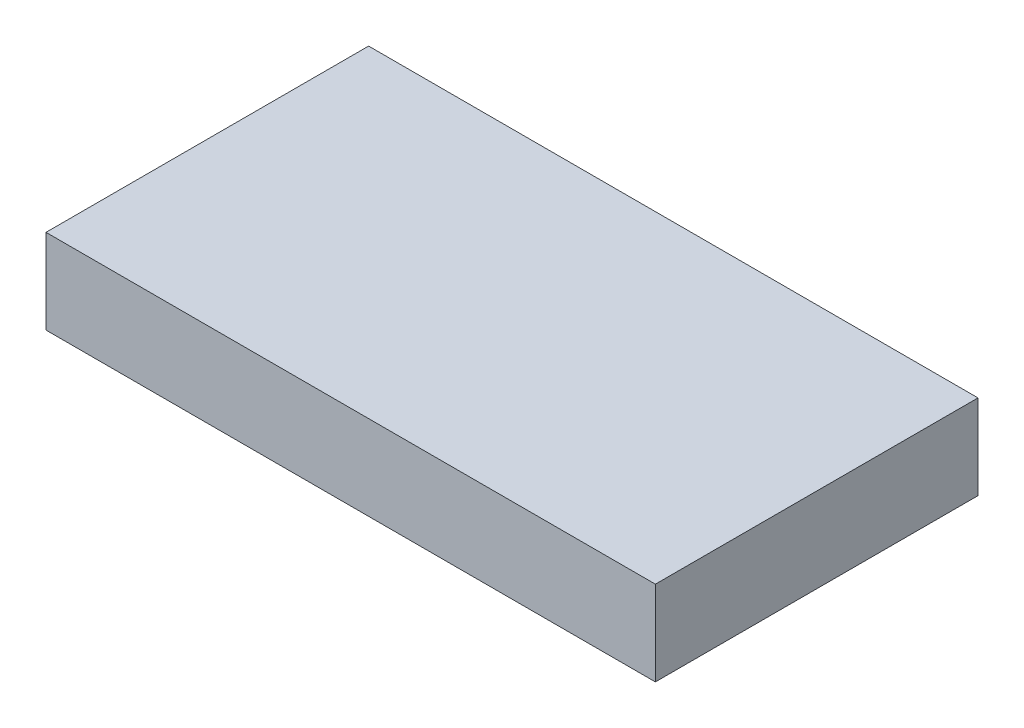
ISO-10303-21;
HEADER;
FILE_DESCRIPTION(('STEP AP214'),'2;1');
FILE_NAME('part.step','',(''),(''),'','','');
FILE_SCHEMA(('AUTOMOTIVE_DESIGN { 1 0 10303 214 1 1 1 1 }'));
ENDSEC;
DATA;
#1=APPLICATION_CONTEXT('core data for automotive mechanical design processes');
#2=APPLICATION_PROTOCOL_DEFINITION('international standard','automotive_design',2000,#1);
#3=PRODUCT_CONTEXT('',#1,'mechanical');
#4=PRODUCT('Part','Part','',(#3));
#5=PRODUCT_RELATED_PRODUCT_CATEGORY('part','',(#4));
#6=PRODUCT_DEFINITION_FORMATION('','',#4);
#7=PRODUCT_DEFINITION_CONTEXT('part definition',#1,'design');
#8=PRODUCT_DEFINITION('design','',#6,#7);
#9=PRODUCT_DEFINITION_SHAPE('','',#8);
#10=(LENGTH_UNIT() NAMED_UNIT(*) SI_UNIT(.MILLI.,.METRE.));
#11=(NAMED_UNIT(*) PLANE_ANGLE_UNIT() SI_UNIT($,.RADIAN.));
#12=(NAMED_UNIT(*) SI_UNIT($,.STERADIAN.) SOLID_ANGLE_UNIT());
#13=UNCERTAINTY_MEASURE_WITH_UNIT(LENGTH_MEASURE(1.E-05),#10,'distance_accuracy_value','');
#14=(GEOMETRIC_REPRESENTATION_CONTEXT(3) GLOBAL_UNCERTAINTY_ASSIGNED_CONTEXT((#13)) GLOBAL_UNIT_ASSIGNED_CONTEXT((#10,
#11,#12)) REPRESENTATION_CONTEXT('',''));
#15=CARTESIAN_POINT('',(0.,0.,0.));
#16=DIRECTION('',(0.,0.,1.));
#17=DIRECTION('',(1.,0.,0.));
#18=AXIS2_PLACEMENT_3D('',#15,#16,#17);
#19=CARTESIAN_POINT('',(-100.45736928953,30.,-18.4232950355312));
#20=DIRECTION('',(1.,0.,0.));
#21=DIRECTION('',(0.,0.,-1.));
#22=AXIS2_PLACEMENT_3D('',#19,#20,#21);
#23=PLANE('',#22);
#24=DIRECTION('',(0.,0.,1.));
#25=VECTOR('',#24,1.);
#26=CARTESIAN_POINT('',(-100.45736928953,0.,-18.4232950355312));
#27=LINE('',#26,#25);
#28=CARTESIAN_POINT('',(-100.45736928953,0.,-18.4232950355312));
#29=VERTEX_POINT('',#28);
#30=CARTESIAN_POINT('',(-100.45736928953,0.,95.8767049644688));
#31=VERTEX_POINT('',#30);
#32=EDGE_CURVE('E96',#29,#31,#27,.T.);
#33=ORIENTED_EDGE('',*,*,#32,.T.);
#34=DIRECTION('',(0.,-1.,0.));
#35=VECTOR('',#34,1.);
#36=CARTESIAN_POINT('',(-100.45736928953,30.,95.8767049644688));
#37=LINE('',#36,#35);
#38=CARTESIAN_POINT('',(-100.45736928953,30.,95.8767049644688));
#39=VERTEX_POINT('',#38);
#40=EDGE_CURVE('E11',#39,#31,#37,.T.);
#41=ORIENTED_EDGE('',*,*,#40,.F.);
#42=DIRECTION('',(0.,0.,1.));
#43=VECTOR('',#42,1.);
#44=CARTESIAN_POINT('',(-100.45736928953,30.,-18.4232950355312));
#45=LINE('',#44,#43);
#46=CARTESIAN_POINT('',(-100.45736928953,30.,-18.4232950355312));
#47=VERTEX_POINT('',#46);
#48=EDGE_CURVE('E84',#47,#39,#45,.T.);
#49=ORIENTED_EDGE('',*,*,#48,.F.);
#50=DIRECTION('',(0.,-1.,0.));
#51=VECTOR('',#50,1.);
#52=CARTESIAN_POINT('',(-100.45736928953,30.,-18.4232950355312));
#53=LINE('',#52,#51);
#54=EDGE_CURVE('E92',#47,#29,#53,.T.);
#55=ORIENTED_EDGE('',*,*,#54,.T.);
#56=EDGE_LOOP('',(#33,#41,#49,#55));
#57=FACE_BOUND('',#56,.T.);
#58=ADVANCED_FACE('F33',(#57),#23,.F.);
#59=CARTESIAN_POINT('',(-100.45736928953,30.,95.8767049644688));
#60=DIRECTION('',(0.,0.,-1.));
#61=DIRECTION('',(-1.,0.,0.));
#62=AXIS2_PLACEMENT_3D('',#59,#60,#61);
#63=PLANE('',#62);
#64=DIRECTION('',(1.,0.,0.));
#65=VECTOR('',#64,1.);
#66=CARTESIAN_POINT('',(-100.45736928953,0.,95.8767049644688));
#67=LINE('',#66,#65);
#68=CARTESIAN_POINT('',(115.44263071047,0.,95.8767049644688));
#69=VERTEX_POINT('',#68);
#70=EDGE_CURVE('E88',#31,#69,#67,.T.);
#71=ORIENTED_EDGE('',*,*,#70,.T.);
#72=DIRECTION('',(0.,-1.,0.));
#73=VECTOR('',#72,1.);
#74=CARTESIAN_POINT('',(115.44263071047,30.,95.8767049644688));
#75=LINE('',#74,#73);
#76=CARTESIAN_POINT('',(115.44263071047,30.,95.8767049644688));
#77=VERTEX_POINT('',#76);
#78=EDGE_CURVE('E41',#77,#69,#75,.T.);
#79=ORIENTED_EDGE('',*,*,#78,.F.);
#80=DIRECTION('',(1.,0.,0.));
#81=VECTOR('',#80,1.);
#82=CARTESIAN_POINT('',(-100.45736928953,30.,95.8767049644688));
#83=LINE('',#82,#81);
#84=EDGE_CURVE('E79',#39,#77,#83,.T.);
#85=ORIENTED_EDGE('',*,*,#84,.F.);
#86=ORIENTED_EDGE('',*,*,#40,.T.);
#87=EDGE_LOOP('',(#71,#79,#85,#86));
#88=FACE_BOUND('',#87,.T.);
#89=ADVANCED_FACE('F87',(#88),#63,.F.);
#90=CARTESIAN_POINT('',(115.44263071047,30.,-18.4232950355312));
#91=DIRECTION('',(-1.,0.,0.));
#92=DIRECTION('',(0.,0.,1.));
#93=AXIS2_PLACEMENT_3D('',#90,#91,#92);
#94=PLANE('',#93);
#95=DIRECTION('',(0.,0.,-1.));
#96=VECTOR('',#95,1.);
#97=CARTESIAN_POINT('',(115.44263071047,0.,-18.4232950355312));
#98=LINE('',#97,#96);
#99=CARTESIAN_POINT('',(115.44263071047,0.,-18.4232950355312));
#100=VERTEX_POINT('',#99);
#101=EDGE_CURVE('E66',#69,#100,#98,.T.);
#102=ORIENTED_EDGE('',*,*,#101,.T.);
#103=DIRECTION('',(0.,-1.,0.));
#104=VECTOR('',#103,1.);
#105=CARTESIAN_POINT('',(115.44263071047,30.,-18.4232950355312));
#106=LINE('',#105,#104);
#107=CARTESIAN_POINT('',(115.44263071047,30.,-18.4232950355312));
#108=VERTEX_POINT('',#107);
#109=EDGE_CURVE('E89',#108,#100,#106,.T.);
#110=ORIENTED_EDGE('',*,*,#109,.F.);
#111=DIRECTION('',(0.,0.,-1.));
#112=VECTOR('',#111,1.);
#113=CARTESIAN_POINT('',(115.44263071047,30.,-18.4232950355312));
#114=LINE('',#113,#112);
#115=EDGE_CURVE('E82',#77,#108,#114,.T.);
#116=ORIENTED_EDGE('',*,*,#115,.F.);
#117=ORIENTED_EDGE('',*,*,#78,.T.);
#118=EDGE_LOOP('',(#102,#110,#116,#117));
#119=FACE_BOUND('',#118,.T.);
#120=ADVANCED_FACE('F90',(#119),#94,.F.);
#121=CARTESIAN_POINT('',(-100.45736928953,30.,-18.4232950355312));
#122=DIRECTION('',(0.,0.,1.));
#123=DIRECTION('',(1.,0.,0.));
#124=AXIS2_PLACEMENT_3D('',#121,#122,#123);
#125=PLANE('',#124);
#126=DIRECTION('',(-1.,0.,0.));
#127=VECTOR('',#126,1.);
#128=CARTESIAN_POINT('',(-100.45736928953,0.,-18.4232950355312));
#129=LINE('',#128,#127);
#130=EDGE_CURVE('E72',#100,#29,#129,.T.);
#131=ORIENTED_EDGE('',*,*,#130,.T.);
#132=ORIENTED_EDGE('',*,*,#54,.F.);
#133=DIRECTION('',(-1.,0.,0.));
#134=VECTOR('',#133,1.);
#135=CARTESIAN_POINT('',(-100.45736928953,30.,-18.4232950355312));
#136=LINE('',#135,#134);
#137=EDGE_CURVE('E49',#108,#47,#136,.T.);
#138=ORIENTED_EDGE('',*,*,#137,.F.);
#139=ORIENTED_EDGE('',*,*,#109,.T.);
#140=EDGE_LOOP('',(#131,#132,#138,#139));
#141=FACE_BOUND('',#140,.T.);
#142=ADVANCED_FACE('F103',(#141),#125,.F.);
#143=CARTESIAN_POINT('',(0.,30.,0.));
#144=DIRECTION('',(0.,1.,0.));
#145=DIRECTION('',(0.,0.,1.));
#146=AXIS2_PLACEMENT_3D('',#143,#144,#145);
#147=PLANE('',#146);
#148=ORIENTED_EDGE('',*,*,#48,.T.);
#149=ORIENTED_EDGE('',*,*,#84,.T.);
#150=ORIENTED_EDGE('',*,*,#115,.T.);
#151=ORIENTED_EDGE('',*,*,#137,.T.);
#152=EDGE_LOOP('',(#148,#149,#150,#151));
#153=FACE_BOUND('',#152,.T.);
#154=ADVANCED_FACE('F80',(#153),#147,.T.);
#155=CARTESIAN_POINT('',(0.,0.,0.));
#156=DIRECTION('',(0.,1.,0.));
#157=DIRECTION('',(0.,0.,1.));
#158=AXIS2_PLACEMENT_3D('',#155,#156,#157);
#159=PLANE('',#158);
#160=ORIENTED_EDGE('',*,*,#32,.F.);
#161=ORIENTED_EDGE('',*,*,#130,.F.);
#162=ORIENTED_EDGE('',*,*,#101,.F.);
#163=ORIENTED_EDGE('',*,*,#70,.F.);
#164=EDGE_LOOP('',(#160,#161,#162,#163));
#165=FACE_BOUND('',#164,.T.);
#166=ADVANCED_FACE('F106',(#165),#159,.F.);
#167=CLOSED_SHELL('',(#58,#89,#120,#142,#154,#166));
#168=MANIFOLD_SOLID_BREP('B2',#167);
#169=ADVANCED_BREP_SHAPE_REPRESENTATION('',(#18,#168),#14);
#170=SHAPE_DEFINITION_REPRESENTATION(#9,#169);
ENDSEC;
END-ISO-10303-21;
